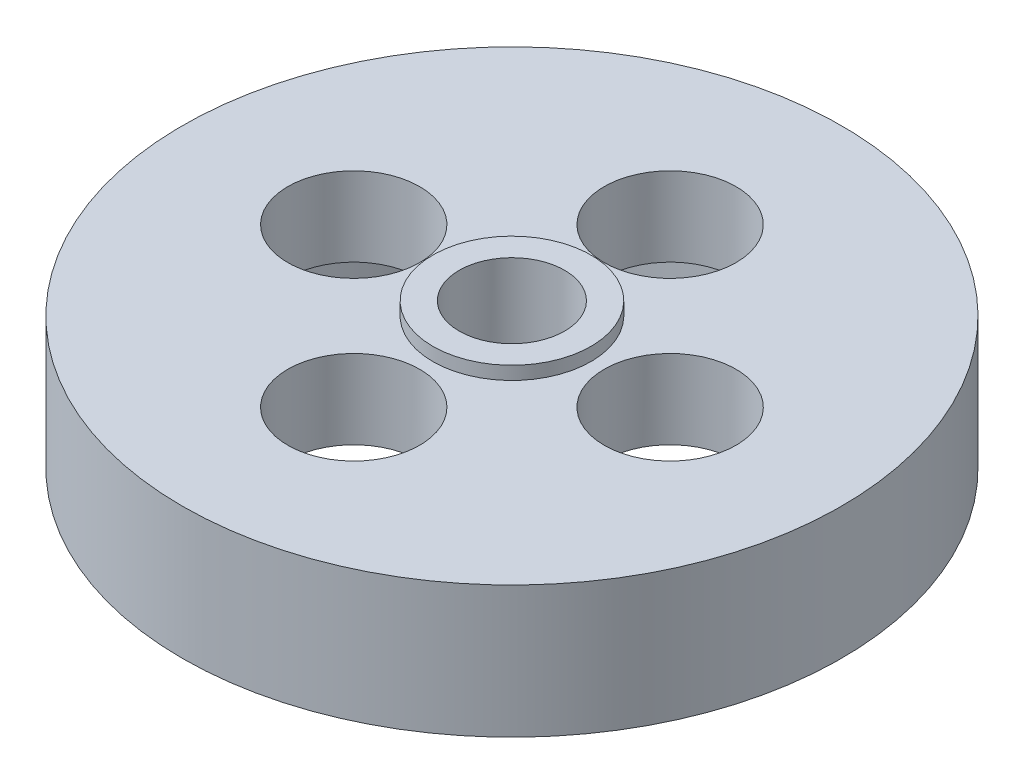
ISO-10303-21;
HEADER;
FILE_DESCRIPTION(('STEP AP214'),'2;1');
FILE_NAME('part.step','',(''),(''),'','','');
FILE_SCHEMA(('AUTOMOTIVE_DESIGN { 1 0 10303 214 1 1 1 1 }'));
ENDSEC;
DATA;
#1=APPLICATION_CONTEXT('core data for automotive mechanical design processes');
#2=APPLICATION_PROTOCOL_DEFINITION('international standard','automotive_design',2000,#1);
#3=PRODUCT_CONTEXT('',#1,'mechanical');
#4=PRODUCT('Part','Part','',(#3));
#5=PRODUCT_RELATED_PRODUCT_CATEGORY('part','',(#4));
#6=PRODUCT_DEFINITION_FORMATION('','',#4);
#7=PRODUCT_DEFINITION_CONTEXT('part definition',#1,'design');
#8=PRODUCT_DEFINITION('design','',#6,#7);
#9=PRODUCT_DEFINITION_SHAPE('','',#8);
#10=(LENGTH_UNIT() NAMED_UNIT(*) SI_UNIT(.MILLI.,.METRE.));
#11=(NAMED_UNIT(*) PLANE_ANGLE_UNIT() SI_UNIT($,.RADIAN.));
#12=(NAMED_UNIT(*) SI_UNIT($,.STERADIAN.) SOLID_ANGLE_UNIT());
#13=UNCERTAINTY_MEASURE_WITH_UNIT(LENGTH_MEASURE(1.E-05),#10,'distance_accuracy_value','');
#14=(GEOMETRIC_REPRESENTATION_CONTEXT(3) GLOBAL_UNCERTAINTY_ASSIGNED_CONTEXT((#13)) GLOBAL_UNIT_ASSIGNED_CONTEXT((#10,
#11,#12)) REPRESENTATION_CONTEXT('',''));
#15=CARTESIAN_POINT('',(0.,0.,0.));
#16=DIRECTION('',(0.,0.,1.));
#17=DIRECTION('',(1.,0.,0.));
#18=AXIS2_PLACEMENT_3D('',#15,#16,#17);
#19=CARTESIAN_POINT('',(12.,0.,0.));
#20=DIRECTION('',(0.,1.,0.));
#21=DIRECTION('',(0.,0.,1.));
#22=AXIS2_PLACEMENT_3D('',#19,#20,#21);
#23=CYLINDRICAL_SURFACE('',#22,5.);
#24=CARTESIAN_POINT('',(12.,10.,0.));
#25=DIRECTION('',(0.,1.,0.));
#26=DIRECTION('',(0.,0.,1.));
#27=AXIS2_PLACEMENT_3D('',#24,#25,#26);
#28=CIRCLE('',#27,5.);
#29=CARTESIAN_POINT('',(12.,10.,5.));
#30=VERTEX_POINT('',#29);
#31=EDGE_CURVE('E47',#30,#30,#28,.T.);
#32=ORIENTED_EDGE('',*,*,#31,.T.);
#33=EDGE_LOOP('',(#32));
#34=FACE_BOUND('',#33,.T.);
#35=CARTESIAN_POINT('',(12.,4.,0.));
#36=DIRECTION('',(0.,-1.,0.));
#37=DIRECTION('',(0.,0.,-1.));
#38=AXIS2_PLACEMENT_3D('',#35,#36,#37);
#39=CIRCLE('',#38,5.);
#40=CARTESIAN_POINT('',(12.,4.,-5.));
#41=VERTEX_POINT('',#40);
#42=EDGE_CURVE('E56',#41,#41,#39,.F.);
#43=ORIENTED_EDGE('',*,*,#42,.F.);
#44=EDGE_LOOP('',(#43));
#45=FACE_BOUND('',#44,.T.);
#46=ADVANCED_FACE('F34',(#34,#45),#23,.F.);
#47=CARTESIAN_POINT('',(0.,0.,0.));
#48=DIRECTION('',(0.,1.,0.));
#49=DIRECTION('',(0.,0.,1.));
#50=AXIS2_PLACEMENT_3D('',#47,#48,#49);
#51=CYLINDRICAL_SURFACE('',#50,4.);
#52=CARTESIAN_POINT('',(0.,4.,0.));
#53=DIRECTION('',(0.,-1.,0.));
#54=DIRECTION('',(0.,0.,-1.));
#55=AXIS2_PLACEMENT_3D('',#52,#53,#54);
#56=CIRCLE('',#55,4.);
#57=CARTESIAN_POINT('',(0.,4.,-4.));
#58=VERTEX_POINT('',#57);
#59=EDGE_CURVE('E63',#58,#58,#56,.F.);
#60=ORIENTED_EDGE('',*,*,#59,.F.);
#61=EDGE_LOOP('',(#60));
#62=FACE_BOUND('',#61,.T.);
#63=CARTESIAN_POINT('',(0.,11.,0.));
#64=DIRECTION('',(0.,1.,0.));
#65=DIRECTION('',(0.,0.,1.));
#66=AXIS2_PLACEMENT_3D('',#63,#64,#65);
#67=CIRCLE('',#66,4.);
#68=CARTESIAN_POINT('',(0.,11.,4.));
#69=VERTEX_POINT('',#68);
#70=EDGE_CURVE('E82',#69,#69,#67,.T.);
#71=ORIENTED_EDGE('',*,*,#70,.T.);
#72=EDGE_LOOP('',(#71));
#73=FACE_BOUND('',#72,.T.);
#74=ADVANCED_FACE('F88',(#62,#73),#51,.F.);
#75=CARTESIAN_POINT('',(1.25693328198353E-13,0.,-12.));
#76=DIRECTION('',(0.,1.,0.));
#77=DIRECTION('',(0.,0.,1.));
#78=AXIS2_PLACEMENT_3D('',#75,#76,#77);
#79=CYLINDRICAL_SURFACE('',#78,5.);
#80=CARTESIAN_POINT('',(1.25693328198353E-13,10.,-12.));
#81=DIRECTION('',(0.,1.,0.));
#82=DIRECTION('',(1.,0.,0.));
#83=AXIS2_PLACEMENT_3D('',#80,#81,#82);
#84=CIRCLE('',#83,5.);
#85=CARTESIAN_POINT('',(5.00000000000012,10.,-12.));
#86=VERTEX_POINT('',#85);
#87=EDGE_CURVE('E52',#86,#86,#84,.T.);
#88=ORIENTED_EDGE('',*,*,#87,.T.);
#89=EDGE_LOOP('',(#88));
#90=FACE_BOUND('',#89,.T.);
#91=CARTESIAN_POINT('',(1.25693328198353E-13,4.,-12.));
#92=DIRECTION('',(0.,-1.,0.));
#93=DIRECTION('',(0.,0.,-1.));
#94=AXIS2_PLACEMENT_3D('',#91,#92,#93);
#95=CIRCLE('',#94,5.);
#96=CARTESIAN_POINT('',(1.25693328198353E-13,4.,-17.));
#97=VERTEX_POINT('',#96);
#98=EDGE_CURVE('E66',#97,#97,#95,.F.);
#99=ORIENTED_EDGE('',*,*,#98,.F.);
#100=EDGE_LOOP('',(#99));
#101=FACE_BOUND('',#100,.T.);
#102=ADVANCED_FACE('F141',(#90,#101),#79,.F.);
#103=CARTESIAN_POINT('',(-12.,0.,0.));
#104=DIRECTION('',(0.,1.,0.));
#105=DIRECTION('',(0.,0.,1.));
#106=AXIS2_PLACEMENT_3D('',#103,#104,#105);
#107=CYLINDRICAL_SURFACE('',#106,5.);
#108=CARTESIAN_POINT('',(-12.,10.,0.));
#109=DIRECTION('',(0.,1.,0.));
#110=DIRECTION('',(0.,0.,-1.));
#111=AXIS2_PLACEMENT_3D('',#108,#109,#110);
#112=CIRCLE('',#111,5.);
#113=CARTESIAN_POINT('',(-12.,10.,-5.));
#114=VERTEX_POINT('',#113);
#115=EDGE_CURVE('E55',#114,#114,#112,.T.);
#116=ORIENTED_EDGE('',*,*,#115,.T.);
#117=EDGE_LOOP('',(#116));
#118=FACE_BOUND('',#117,.T.);
#119=CARTESIAN_POINT('',(-12.,4.,0.));
#120=DIRECTION('',(0.,-1.,0.));
#121=DIRECTION('',(0.,0.,-1.));
#122=AXIS2_PLACEMENT_3D('',#119,#120,#121);
#123=CIRCLE('',#122,5.);
#124=CARTESIAN_POINT('',(-12.,4.,-5.));
#125=VERTEX_POINT('',#124);
#126=EDGE_CURVE('E69',#125,#125,#123,.F.);
#127=ORIENTED_EDGE('',*,*,#126,.F.);
#128=EDGE_LOOP('',(#127));
#129=FACE_BOUND('',#128,.T.);
#130=ADVANCED_FACE('F137',(#118,#129),#107,.F.);
#131=CARTESIAN_POINT('',(0.,0.,12.));
#132=DIRECTION('',(0.,1.,0.));
#133=DIRECTION('',(0.,0.,1.));
#134=AXIS2_PLACEMENT_3D('',#131,#132,#133);
#135=CYLINDRICAL_SURFACE('',#134,5.);
#136=CARTESIAN_POINT('',(0.,10.,12.));
#137=DIRECTION('',(0.,1.,0.));
#138=DIRECTION('',(-1.,0.,0.));
#139=AXIS2_PLACEMENT_3D('',#136,#137,#138);
#140=CIRCLE('',#139,5.);
#141=CARTESIAN_POINT('',(-5.00000000000004,10.,12.));
#142=VERTEX_POINT('',#141);
#143=EDGE_CURVE('E51',#142,#142,#140,.T.);
#144=ORIENTED_EDGE('',*,*,#143,.T.);
#145=EDGE_LOOP('',(#144));
#146=FACE_BOUND('',#145,.T.);
#147=CARTESIAN_POINT('',(0.,4.,12.));
#148=DIRECTION('',(0.,-1.,0.));
#149=DIRECTION('',(0.,0.,-1.));
#150=AXIS2_PLACEMENT_3D('',#147,#148,#149);
#151=CIRCLE('',#150,5.);
#152=CARTESIAN_POINT('',(0.,4.,7.));
#153=VERTEX_POINT('',#152);
#154=EDGE_CURVE('E38',#153,#153,#151,.F.);
#155=ORIENTED_EDGE('',*,*,#154,.F.);
#156=EDGE_LOOP('',(#155));
#157=FACE_BOUND('',#156,.T.);
#158=ADVANCED_FACE('F134',(#146,#157),#135,.F.);
#159=CARTESIAN_POINT('',(0.,10.,0.));
#160=DIRECTION('',(0.,-1.,0.));
#161=DIRECTION('',(0.,0.,-1.));
#162=AXIS2_PLACEMENT_3D('',#159,#160,#161);
#163=CYLINDRICAL_SURFACE('',#162,25.);
#164=CARTESIAN_POINT('',(0.,10.,0.));
#165=DIRECTION('',(0.,1.,0.));
#166=DIRECTION('',(0.,0.,1.));
#167=AXIS2_PLACEMENT_3D('',#164,#165,#166);
#168=CIRCLE('',#167,25.);
#169=CARTESIAN_POINT('',(0.,10.,25.));
#170=VERTEX_POINT('',#169);
#171=EDGE_CURVE('E10',#170,#170,#168,.T.);
#172=ORIENTED_EDGE('',*,*,#171,.F.);
#173=EDGE_LOOP('',(#172));
#174=FACE_BOUND('',#173,.T.);
#175=CARTESIAN_POINT('',(0.,0.,0.));
#176=DIRECTION('',(0.,1.,0.));
#177=DIRECTION('',(0.,0.,1.));
#178=AXIS2_PLACEMENT_3D('',#175,#176,#177);
#179=CIRCLE('',#178,25.);
#180=CARTESIAN_POINT('',(0.,0.,25.));
#181=VERTEX_POINT('',#180);
#182=EDGE_CURVE('E42',#181,#181,#179,.T.);
#183=ORIENTED_EDGE('',*,*,#182,.T.);
#184=EDGE_LOOP('',(#183));
#185=FACE_BOUND('',#184,.T.);
#186=ADVANCED_FACE('F36',(#174,#185),#163,.T.);
#187=CARTESIAN_POINT('',(0.,10.,0.));
#188=DIRECTION('',(0.,1.,0.));
#189=DIRECTION('',(0.,0.,1.));
#190=AXIS2_PLACEMENT_3D('',#187,#188,#189);
#191=PLANE('',#190);
#192=CARTESIAN_POINT('',(0.,10.,0.));
#193=DIRECTION('',(0.,1.,0.));
#194=DIRECTION('',(0.,0.,1.));
#195=AXIS2_PLACEMENT_3D('',#192,#193,#194);
#196=CIRCLE('',#195,6.);
#197=CARTESIAN_POINT('',(0.,10.,6.));
#198=VERTEX_POINT('',#197);
#199=EDGE_CURVE('E79',#198,#198,#196,.T.);
#200=ORIENTED_EDGE('',*,*,#199,.F.);
#201=EDGE_LOOP('',(#200));
#202=FACE_BOUND('',#201,.T.);
#203=ORIENTED_EDGE('',*,*,#143,.F.);
#204=EDGE_LOOP('',(#203));
#205=FACE_BOUND('',#204,.T.);
#206=ORIENTED_EDGE('',*,*,#115,.F.);
#207=EDGE_LOOP('',(#206));
#208=FACE_BOUND('',#207,.T.);
#209=ORIENTED_EDGE('',*,*,#87,.F.);
#210=EDGE_LOOP('',(#209));
#211=FACE_BOUND('',#210,.T.);
#212=ORIENTED_EDGE('',*,*,#31,.F.);
#213=EDGE_LOOP('',(#212));
#214=FACE_BOUND('',#213,.T.);
#215=ORIENTED_EDGE('',*,*,#171,.T.);
#216=EDGE_LOOP('',(#215));
#217=FACE_BOUND('',#216,.T.);
#218=ADVANCED_FACE('F103',(#202,#205,#208,#211,#214,#217),#191,.T.);
#219=CARTESIAN_POINT('',(0.,0.,0.));
#220=DIRECTION('',(0.,1.,0.));
#221=DIRECTION('',(0.,0.,1.));
#222=AXIS2_PLACEMENT_3D('',#219,#220,#221);
#223=PLANE('',#222);
#224=CARTESIAN_POINT('',(0.,0.,0.));
#225=DIRECTION('',(0.,-1.,0.));
#226=DIRECTION('',(0.,0.,-1.));
#227=AXIS2_PLACEMENT_3D('',#224,#225,#226);
#228=CIRCLE('',#227,18.);
#229=CARTESIAN_POINT('',(0.,0.,-18.));
#230=VERTEX_POINT('',#229);
#231=EDGE_CURVE('E72',#230,#230,#228,.T.);
#232=ORIENTED_EDGE('',*,*,#231,.F.);
#233=EDGE_LOOP('',(#232));
#234=FACE_BOUND('',#233,.T.);
#235=ORIENTED_EDGE('',*,*,#182,.F.);
#236=EDGE_LOOP('',(#235));
#237=FACE_BOUND('',#236,.T.);
#238=ADVANCED_FACE('F106',(#234,#237),#223,.F.);
#239=CARTESIAN_POINT('',(0.,4.,0.));
#240=DIRECTION('',(0.,-1.,0.));
#241=DIRECTION('',(0.,0.,-1.));
#242=AXIS2_PLACEMENT_3D('',#239,#240,#241);
#243=PLANE('',#242);
#244=CARTESIAN_POINT('',(0.,4.,0.));
#245=DIRECTION('',(0.,-1.,0.));
#246=DIRECTION('',(0.,0.,-1.));
#247=AXIS2_PLACEMENT_3D('',#244,#245,#246);
#248=CIRCLE('',#247,18.);
#249=CARTESIAN_POINT('',(0.,4.,-18.));
#250=VERTEX_POINT('',#249);
#251=EDGE_CURVE('E75',#250,#250,#248,.T.);
#252=ORIENTED_EDGE('',*,*,#251,.T.);
#253=EDGE_LOOP('',(#252));
#254=FACE_BOUND('',#253,.T.);
#255=ORIENTED_EDGE('',*,*,#154,.T.);
#256=EDGE_LOOP('',(#255));
#257=FACE_BOUND('',#256,.T.);
#258=ORIENTED_EDGE('',*,*,#126,.T.);
#259=EDGE_LOOP('',(#258));
#260=FACE_BOUND('',#259,.T.);
#261=ORIENTED_EDGE('',*,*,#98,.T.);
#262=EDGE_LOOP('',(#261));
#263=FACE_BOUND('',#262,.T.);
#264=ORIENTED_EDGE('',*,*,#59,.T.);
#265=EDGE_LOOP('',(#264));
#266=FACE_BOUND('',#265,.T.);
#267=ORIENTED_EDGE('',*,*,#42,.T.);
#268=EDGE_LOOP('',(#267));
#269=FACE_BOUND('',#268,.T.);
#270=ADVANCED_FACE('F121',(#254,#257,#260,#263,#266,#269),#243,.T.);
#271=CARTESIAN_POINT('',(0.,4.,0.));
#272=DIRECTION('',(0.,-1.,0.));
#273=DIRECTION('',(0.,0.,-1.));
#274=AXIS2_PLACEMENT_3D('',#271,#272,#273);
#275=CYLINDRICAL_SURFACE('',#274,18.);
#276=ORIENTED_EDGE('',*,*,#251,.F.);
#277=EDGE_LOOP('',(#276));
#278=FACE_BOUND('',#277,.T.);
#279=ORIENTED_EDGE('',*,*,#231,.T.);
#280=EDGE_LOOP('',(#279));
#281=FACE_BOUND('',#280,.T.);
#282=ADVANCED_FACE('F94',(#278,#281),#275,.F.);
#283=CARTESIAN_POINT('',(0.,11.,0.));
#284=DIRECTION('',(0.,1.,0.));
#285=DIRECTION('',(0.,0.,1.));
#286=AXIS2_PLACEMENT_3D('',#283,#284,#285);
#287=PLANE('',#286);
#288=ORIENTED_EDGE('',*,*,#70,.F.);
#289=EDGE_LOOP('',(#288));
#290=FACE_BOUND('',#289,.T.);
#291=CARTESIAN_POINT('',(0.,11.,0.));
#292=DIRECTION('',(0.,1.,0.));
#293=DIRECTION('',(0.,0.,1.));
#294=AXIS2_PLACEMENT_3D('',#291,#292,#293);
#295=CIRCLE('',#294,6.);
#296=CARTESIAN_POINT('',(0.,11.,6.));
#297=VERTEX_POINT('',#296);
#298=EDGE_CURVE('E76',#297,#297,#295,.T.);
#299=ORIENTED_EDGE('',*,*,#298,.T.);
#300=EDGE_LOOP('',(#299));
#301=FACE_BOUND('',#300,.T.);
#302=ADVANCED_FACE('F90',(#290,#301),#287,.T.);
#303=CARTESIAN_POINT('',(0.,11.,0.));
#304=DIRECTION('',(0.,-1.,0.));
#305=DIRECTION('',(0.,0.,-1.));
#306=AXIS2_PLACEMENT_3D('',#303,#304,#305);
#307=CYLINDRICAL_SURFACE('',#306,6.);
#308=ORIENTED_EDGE('',*,*,#298,.F.);
#309=EDGE_LOOP('',(#308));
#310=FACE_BOUND('',#309,.T.);
#311=ORIENTED_EDGE('',*,*,#199,.T.);
#312=EDGE_LOOP('',(#311));
#313=FACE_BOUND('',#312,.T.);
#314=ADVANCED_FACE('F93',(#310,#313),#307,.T.);
#315=CLOSED_SHELL('',(#46,#74,#102,#130,#158,#186,#218,#238,#270,#282,#302,#314));
#316=MANIFOLD_SOLID_BREP('B2',#315);
#317=ADVANCED_BREP_SHAPE_REPRESENTATION('',(#18,#316),#14);
#318=SHAPE_DEFINITION_REPRESENTATION(#9,#317);
ENDSEC;
END-ISO-10303-21;
